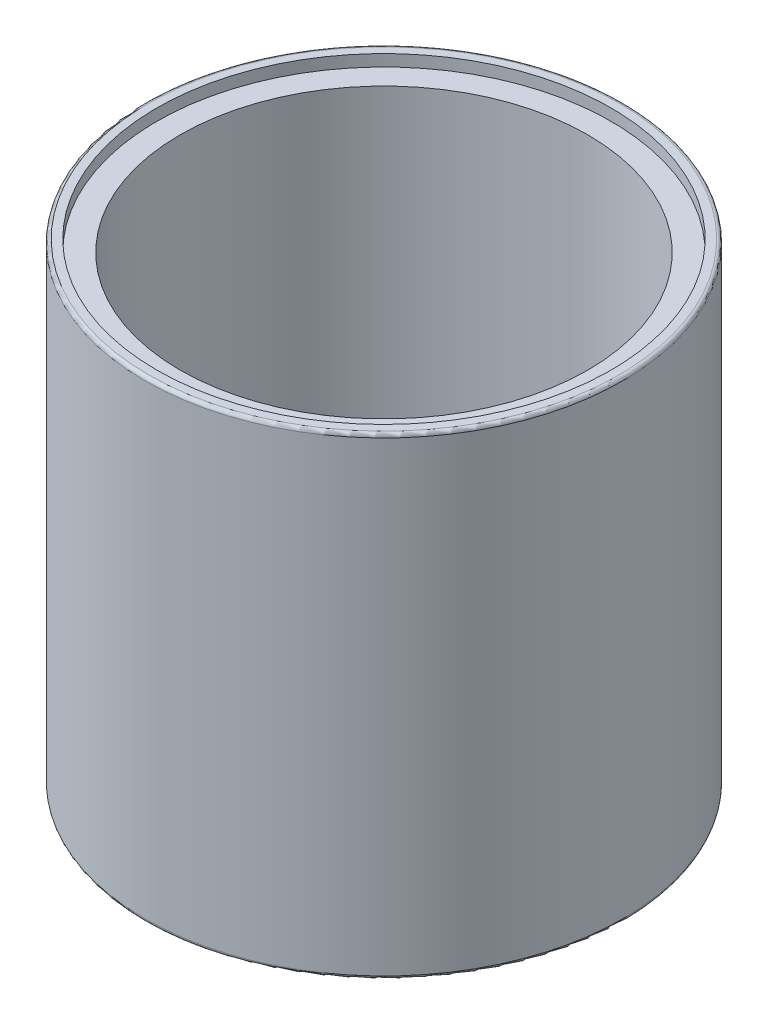
ISO-10303-21;
HEADER;
FILE_DESCRIPTION(('STEP AP214'),'2;1');
FILE_NAME('part.step','',(''),(''),'','','');
FILE_SCHEMA(('AUTOMOTIVE_DESIGN { 1 0 10303 214 1 1 1 1 }'));
ENDSEC;
DATA;
#1=APPLICATION_CONTEXT('core data for automotive mechanical design processes');
#2=APPLICATION_PROTOCOL_DEFINITION('international standard','automotive_design',2000,#1);
#3=PRODUCT_CONTEXT('',#1,'mechanical');
#4=PRODUCT('Part','Part','',(#3));
#5=PRODUCT_RELATED_PRODUCT_CATEGORY('part','',(#4));
#6=PRODUCT_DEFINITION_FORMATION('','',#4);
#7=PRODUCT_DEFINITION_CONTEXT('part definition',#1,'design');
#8=PRODUCT_DEFINITION('design','',#6,#7);
#9=PRODUCT_DEFINITION_SHAPE('','',#8);
#10=(LENGTH_UNIT() NAMED_UNIT(*) SI_UNIT(.MILLI.,.METRE.));
#11=(NAMED_UNIT(*) PLANE_ANGLE_UNIT() SI_UNIT($,.RADIAN.));
#12=(NAMED_UNIT(*) SI_UNIT($,.STERADIAN.) SOLID_ANGLE_UNIT());
#13=UNCERTAINTY_MEASURE_WITH_UNIT(LENGTH_MEASURE(1.E-05),#10,'distance_accuracy_value','');
#14=(GEOMETRIC_REPRESENTATION_CONTEXT(3) GLOBAL_UNCERTAINTY_ASSIGNED_CONTEXT((#13)) GLOBAL_UNIT_ASSIGNED_CONTEXT((#10,
#11,#12)) REPRESENTATION_CONTEXT('',''));
#15=CARTESIAN_POINT('',(0.,0.,0.));
#16=DIRECTION('',(0.,0.,1.));
#17=DIRECTION('',(1.,0.,0.));
#18=AXIS2_PLACEMENT_3D('',#15,#16,#17);
#19=CARTESIAN_POINT('',(35.,38.6,0.));
#20=DIRECTION('',(0.,-1.,0.));
#21=DIRECTION('',(0.,0.,-1.));
#22=AXIS2_PLACEMENT_3D('',#19,#20,#21);
#23=PLANE('',#22);
#24=CARTESIAN_POINT('',(0.,38.6,0.));
#25=DIRECTION('',(0.,1.,0.));
#26=DIRECTION('',(0.,0.,1.));
#27=AXIS2_PLACEMENT_3D('',#24,#25,#26);
#28=CIRCLE('',#27,35.);
#29=CARTESIAN_POINT('',(0.,38.6,35.));
#30=VERTEX_POINT('',#29);
#31=EDGE_CURVE('E81',#30,#30,#28,.T.);
#32=ORIENTED_EDGE('',*,*,#31,.F.);
#33=EDGE_LOOP('',(#32));
#34=FACE_BOUND('',#33,.T.);
#35=CARTESIAN_POINT('',(0.,38.6,0.));
#36=DIRECTION('',(0.,1.,0.));
#37=DIRECTION('',(0.,0.,1.));
#38=AXIS2_PLACEMENT_3D('',#35,#36,#37);
#39=CIRCLE('',#38,39.);
#40=CARTESIAN_POINT('',(0.,38.6,39.));
#41=VERTEX_POINT('',#40);
#42=EDGE_CURVE('E10',#41,#41,#39,.T.);
#43=ORIENTED_EDGE('',*,*,#42,.T.);
#44=EDGE_LOOP('',(#43));
#45=FACE_BOUND('',#44,.T.);
#46=ADVANCED_FACE('F35',(#34,#45),#23,.F.);
#47=CARTESIAN_POINT('',(0.,62.3869405003034,0.));
#48=DIRECTION('',(0.,1.,0.));
#49=DIRECTION('',(0.,0.,1.));
#50=AXIS2_PLACEMENT_3D('',#47,#48,#49);
#51=CYLINDRICAL_SURFACE('',#50,39.);
#52=ORIENTED_EDGE('',*,*,#42,.F.);
#53=EDGE_LOOP('',(#52));
#54=FACE_BOUND('',#53,.T.);
#55=CARTESIAN_POINT('',(0.,40.6,0.));
#56=DIRECTION('',(0.,1.,0.));
#57=DIRECTION('',(0.,0.,1.));
#58=AXIS2_PLACEMENT_3D('',#55,#56,#57);
#59=CIRCLE('',#58,39.);
#60=CARTESIAN_POINT('',(0.,40.6,39.));
#61=VERTEX_POINT('',#60);
#62=EDGE_CURVE('E41',#61,#61,#59,.T.);
#63=ORIENTED_EDGE('',*,*,#62,.T.);
#64=EDGE_LOOP('',(#63));
#65=FACE_BOUND('',#64,.T.);
#66=ADVANCED_FACE('F88',(#54,#65),#51,.F.);
#67=CARTESIAN_POINT('',(39.,40.6,0.));
#68=DIRECTION('',(0.,-1.,0.));
#69=DIRECTION('',(0.,0.,-1.));
#70=AXIS2_PLACEMENT_3D('',#67,#68,#69);
#71=PLANE('',#70);
#72=ORIENTED_EDGE('',*,*,#62,.F.);
#73=EDGE_LOOP('',(#72));
#74=FACE_BOUND('',#73,.T.);
#75=CARTESIAN_POINT('',(0.,40.6,0.));
#76=DIRECTION('',(0.,1.,0.));
#77=DIRECTION('',(0.,0.,1.));
#78=AXIS2_PLACEMENT_3D('',#75,#76,#77);
#79=CIRCLE('',#78,40.4);
#80=CARTESIAN_POINT('',(0.,40.6,40.4));
#81=VERTEX_POINT('',#80);
#82=EDGE_CURVE('E45',#81,#81,#79,.T.);
#83=ORIENTED_EDGE('',*,*,#82,.T.);
#84=EDGE_LOOP('',(#83));
#85=FACE_BOUND('',#84,.T.);
#86=ADVANCED_FACE('F92',(#74,#85),#71,.F.);
#87=CARTESIAN_POINT('',(0.,40.,0.));
#88=DIRECTION('',(0.,1.,0.));
#89=DIRECTION('',(0.,0.,1.));
#90=AXIS2_PLACEMENT_3D('',#87,#88,#89);
#91=TOROIDAL_SURFACE('',#90,40.4,0.600000000000007);
#92=ORIENTED_EDGE('',*,*,#82,.F.);
#93=EDGE_LOOP('',(#92));
#94=FACE_BOUND('',#93,.T.);
#95=CARTESIAN_POINT('',(0.,40.,0.));
#96=DIRECTION('',(0.,1.,0.));
#97=DIRECTION('',(0.,0.,1.));
#98=AXIS2_PLACEMENT_3D('',#95,#96,#97);
#99=CIRCLE('',#98,41.);
#100=CARTESIAN_POINT('',(0.,40.,41.));
#101=VERTEX_POINT('',#100);
#102=EDGE_CURVE('E49',#101,#101,#99,.T.);
#103=ORIENTED_EDGE('',*,*,#102,.T.);
#104=EDGE_LOOP('',(#103));
#105=FACE_BOUND('',#104,.T.);
#106=ADVANCED_FACE('F97',(#94,#105),#91,.T.);
#107=CARTESIAN_POINT('',(0.,62.3869405003034,0.));
#108=DIRECTION('',(0.,1.,0.));
#109=DIRECTION('',(0.,0.,1.));
#110=AXIS2_PLACEMENT_3D('',#107,#108,#109);
#111=CYLINDRICAL_SURFACE('',#110,41.);
#112=ORIENTED_EDGE('',*,*,#102,.F.);
#113=EDGE_LOOP('',(#112));
#114=FACE_BOUND('',#113,.T.);
#115=CARTESIAN_POINT('',(0.,-40.,0.));
#116=DIRECTION('',(0.,1.,0.));
#117=DIRECTION('',(0.,0.,1.));
#118=AXIS2_PLACEMENT_3D('',#115,#116,#117);
#119=CIRCLE('',#118,41.);
#120=CARTESIAN_POINT('',(0.,-40.,41.));
#121=VERTEX_POINT('',#120);
#122=EDGE_CURVE('E54',#121,#121,#119,.T.);
#123=ORIENTED_EDGE('',*,*,#122,.T.);
#124=EDGE_LOOP('',(#123));
#125=FACE_BOUND('',#124,.T.);
#126=ADVANCED_FACE('F103',(#114,#125),#111,.T.);
#127=CARTESIAN_POINT('',(0.,-40.,0.));
#128=DIRECTION('',(0.,1.,0.));
#129=DIRECTION('',(0.,0.,1.));
#130=AXIS2_PLACEMENT_3D('',#127,#128,#129);
#131=TOROIDAL_SURFACE('',#130,40.4,0.600000000000007);
#132=ORIENTED_EDGE('',*,*,#122,.F.);
#133=EDGE_LOOP('',(#132));
#134=FACE_BOUND('',#133,.T.);
#135=CARTESIAN_POINT('',(0.,-40.6,0.));
#136=DIRECTION('',(0.,1.,0.));
#137=DIRECTION('',(0.,0.,1.));
#138=AXIS2_PLACEMENT_3D('',#135,#136,#137);
#139=CIRCLE('',#138,40.4);
#140=CARTESIAN_POINT('',(0.,-40.6,40.4));
#141=VERTEX_POINT('',#140);
#142=EDGE_CURVE('E57',#141,#141,#139,.T.);
#143=ORIENTED_EDGE('',*,*,#142,.T.);
#144=EDGE_LOOP('',(#143));
#145=FACE_BOUND('',#144,.T.);
#146=ADVANCED_FACE('F107',(#134,#145),#131,.T.);
#147=CARTESIAN_POINT('',(39.,-40.6,0.));
#148=DIRECTION('',(0.,1.,0.));
#149=DIRECTION('',(0.,0.,1.));
#150=AXIS2_PLACEMENT_3D('',#147,#148,#149);
#151=PLANE('',#150);
#152=ORIENTED_EDGE('',*,*,#142,.F.);
#153=EDGE_LOOP('',(#152));
#154=FACE_BOUND('',#153,.T.);
#155=CARTESIAN_POINT('',(0.,-40.6,0.));
#156=DIRECTION('',(0.,1.,0.));
#157=DIRECTION('',(0.,0.,1.));
#158=AXIS2_PLACEMENT_3D('',#155,#156,#157);
#159=CIRCLE('',#158,39.);
#160=CARTESIAN_POINT('',(0.,-40.6,39.));
#161=VERTEX_POINT('',#160);
#162=EDGE_CURVE('E60',#161,#161,#159,.T.);
#163=ORIENTED_EDGE('',*,*,#162,.T.);
#164=EDGE_LOOP('',(#163));
#165=FACE_BOUND('',#164,.T.);
#166=ADVANCED_FACE('F111',(#154,#165),#151,.F.);
#167=CARTESIAN_POINT('',(0.,62.3869405003034,0.));
#168=DIRECTION('',(0.,1.,0.));
#169=DIRECTION('',(0.,0.,1.));
#170=AXIS2_PLACEMENT_3D('',#167,#168,#169);
#171=CYLINDRICAL_SURFACE('',#170,39.);
#172=ORIENTED_EDGE('',*,*,#162,.F.);
#173=EDGE_LOOP('',(#172));
#174=FACE_BOUND('',#173,.T.);
#175=CARTESIAN_POINT('',(0.,-38.6,0.));
#176=DIRECTION('',(0.,1.,0.));
#177=DIRECTION('',(0.,0.,1.));
#178=AXIS2_PLACEMENT_3D('',#175,#176,#177);
#179=CIRCLE('',#178,39.);
#180=CARTESIAN_POINT('',(0.,-38.6,39.));
#181=VERTEX_POINT('',#180);
#182=EDGE_CURVE('E63',#181,#181,#179,.T.);
#183=ORIENTED_EDGE('',*,*,#182,.T.);
#184=EDGE_LOOP('',(#183));
#185=FACE_BOUND('',#184,.T.);
#186=ADVANCED_FACE('F115',(#174,#185),#171,.F.);
#187=CARTESIAN_POINT('',(38.197365935516,-38.6,0.));
#188=DIRECTION('',(0.,1.,0.));
#189=DIRECTION('',(0.,0.,1.));
#190=AXIS2_PLACEMENT_3D('',#187,#188,#189);
#191=PLANE('',#190);
#192=ORIENTED_EDGE('',*,*,#182,.F.);
#193=EDGE_LOOP('',(#192));
#194=FACE_BOUND('',#193,.T.);
#195=CARTESIAN_POINT('',(0.,-38.6,0.));
#196=DIRECTION('',(0.,1.,0.));
#197=DIRECTION('',(0.,0.,1.));
#198=AXIS2_PLACEMENT_3D('',#195,#196,#197);
#199=CIRCLE('',#198,38.197365935516);
#200=CARTESIAN_POINT('',(0.,-38.6,38.197365935516));
#201=VERTEX_POINT('',#200);
#202=EDGE_CURVE('E66',#201,#201,#199,.T.);
#203=ORIENTED_EDGE('',*,*,#202,.T.);
#204=EDGE_LOOP('',(#203));
#205=FACE_BOUND('',#204,.T.);
#206=ADVANCED_FACE('F119',(#194,#205),#191,.F.);
#207=CARTESIAN_POINT('',(0.,62.3869405003034,0.));
#208=DIRECTION('',(0.,1.,0.));
#209=DIRECTION('',(0.,0.,1.));
#210=AXIS2_PLACEMENT_3D('',#207,#208,#209);
#211=CYLINDRICAL_SURFACE('',#210,38.197365935516);
#212=ORIENTED_EDGE('',*,*,#202,.F.);
#213=EDGE_LOOP('',(#212));
#214=FACE_BOUND('',#213,.T.);
#215=CARTESIAN_POINT('',(0.,-41.2413333215069,0.));
#216=DIRECTION('',(0.,1.,0.));
#217=DIRECTION('',(0.,0.,1.));
#218=AXIS2_PLACEMENT_3D('',#215,#216,#217);
#219=CIRCLE('',#218,38.197365935516);
#220=CARTESIAN_POINT('',(0.,-41.2413333215069,38.197365935516));
#221=VERTEX_POINT('',#220);
#222=EDGE_CURVE('E69',#221,#221,#219,.T.);
#223=ORIENTED_EDGE('',*,*,#222,.T.);
#224=EDGE_LOOP('',(#223));
#225=FACE_BOUND('',#224,.T.);
#226=ADVANCED_FACE('F123',(#214,#225),#211,.T.);
#227=CARTESIAN_POINT('',(36.5017587042709,-41.2413333215069,0.));
#228=DIRECTION('',(0.,1.,0.));
#229=DIRECTION('',(0.,0.,1.));
#230=AXIS2_PLACEMENT_3D('',#227,#228,#229);
#231=PLANE('',#230);
#232=ORIENTED_EDGE('',*,*,#222,.F.);
#233=EDGE_LOOP('',(#232));
#234=FACE_BOUND('',#233,.T.);
#235=CARTESIAN_POINT('',(0.,-41.2413333215069,0.));
#236=DIRECTION('',(0.,1.,0.));
#237=DIRECTION('',(0.,0.,1.));
#238=AXIS2_PLACEMENT_3D('',#235,#236,#237);
#239=CIRCLE('',#238,36.5017587042709);
#240=CARTESIAN_POINT('',(0.,-41.2413333215069,36.5017587042709));
#241=VERTEX_POINT('',#240);
#242=EDGE_CURVE('E72',#241,#241,#239,.T.);
#243=ORIENTED_EDGE('',*,*,#242,.T.);
#244=EDGE_LOOP('',(#243));
#245=FACE_BOUND('',#244,.T.);
#246=ADVANCED_FACE('F127',(#234,#245),#231,.F.);
#247=CARTESIAN_POINT('',(0.,62.3869405003034,0.));
#248=DIRECTION('',(0.,1.,0.));
#249=DIRECTION('',(0.,0.,1.));
#250=AXIS2_PLACEMENT_3D('',#247,#248,#249);
#251=CYLINDRICAL_SURFACE('',#250,36.5017587042709);
#252=ORIENTED_EDGE('',*,*,#242,.F.);
#253=EDGE_LOOP('',(#252));
#254=FACE_BOUND('',#253,.T.);
#255=CARTESIAN_POINT('',(0.,-38.6,0.));
#256=DIRECTION('',(0.,1.,0.));
#257=DIRECTION('',(0.,0.,1.));
#258=AXIS2_PLACEMENT_3D('',#255,#256,#257);
#259=CIRCLE('',#258,36.5017587042709);
#260=CARTESIAN_POINT('',(0.,-38.6,36.5017587042709));
#261=VERTEX_POINT('',#260);
#262=EDGE_CURVE('E75',#261,#261,#259,.T.);
#263=ORIENTED_EDGE('',*,*,#262,.T.);
#264=EDGE_LOOP('',(#263));
#265=FACE_BOUND('',#264,.T.);
#266=ADVANCED_FACE('F131',(#254,#265),#251,.F.);
#267=CARTESIAN_POINT('',(35.,-38.6,0.));
#268=DIRECTION('',(0.,1.,0.));
#269=DIRECTION('',(0.,0.,1.));
#270=AXIS2_PLACEMENT_3D('',#267,#268,#269);
#271=PLANE('',#270);
#272=ORIENTED_EDGE('',*,*,#262,.F.);
#273=EDGE_LOOP('',(#272));
#274=FACE_BOUND('',#273,.T.);
#275=CARTESIAN_POINT('',(0.,-38.6,0.));
#276=DIRECTION('',(0.,1.,0.));
#277=DIRECTION('',(0.,0.,1.));
#278=AXIS2_PLACEMENT_3D('',#275,#276,#277);
#279=CIRCLE('',#278,35.);
#280=CARTESIAN_POINT('',(0.,-38.6,35.));
#281=VERTEX_POINT('',#280);
#282=EDGE_CURVE('E78',#281,#281,#279,.T.);
#283=ORIENTED_EDGE('',*,*,#282,.T.);
#284=EDGE_LOOP('',(#283));
#285=FACE_BOUND('',#284,.T.);
#286=ADVANCED_FACE('F135',(#274,#285),#271,.F.);
#287=CARTESIAN_POINT('',(0.,62.3869405003034,0.));
#288=DIRECTION('',(0.,1.,0.));
#289=DIRECTION('',(0.,0.,1.));
#290=AXIS2_PLACEMENT_3D('',#287,#288,#289);
#291=CYLINDRICAL_SURFACE('',#290,35.);
#292=ORIENTED_EDGE('',*,*,#282,.F.);
#293=EDGE_LOOP('',(#292));
#294=FACE_BOUND('',#293,.T.);
#295=ORIENTED_EDGE('',*,*,#31,.T.);
#296=EDGE_LOOP('',(#295));
#297=FACE_BOUND('',#296,.T.);
#298=ADVANCED_FACE('F85',(#294,#297),#291,.F.);
#299=CLOSED_SHELL('',(#46,#66,#86,#106,#126,#146,#166,#186,#206,#226,#246,#266,#286,#298));
#300=MANIFOLD_SOLID_BREP('B2',#299);
#301=ADVANCED_BREP_SHAPE_REPRESENTATION('',(#18,#300),#14);
#302=SHAPE_DEFINITION_REPRESENTATION(#9,#301);
ENDSEC;
END-ISO-10303-21;
